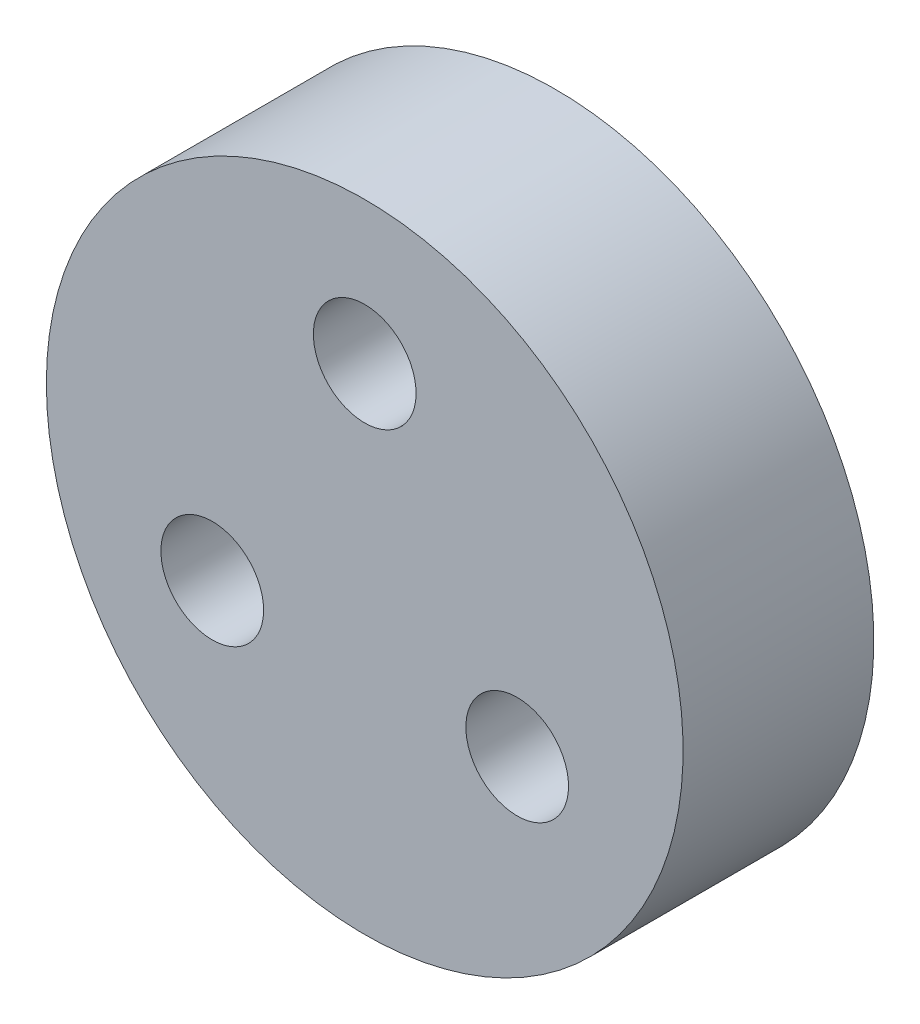
ISO-10303-21;
HEADER;
FILE_DESCRIPTION(('STEP AP214'),'2;1');
FILE_NAME('part.step','',(''),(''),'','','');
FILE_SCHEMA(('AUTOMOTIVE_DESIGN { 1 0 10303 214 1 1 1 1 }'));
ENDSEC;
DATA;
#1=APPLICATION_CONTEXT('core data for automotive mechanical design processes');
#2=APPLICATION_PROTOCOL_DEFINITION('international standard','automotive_design',2000,#1);
#3=PRODUCT_CONTEXT('',#1,'mechanical');
#4=PRODUCT('Part','Part','',(#3));
#5=PRODUCT_RELATED_PRODUCT_CATEGORY('part','',(#4));
#6=PRODUCT_DEFINITION_FORMATION('','',#4);
#7=PRODUCT_DEFINITION_CONTEXT('part definition',#1,'design');
#8=PRODUCT_DEFINITION('design','',#6,#7);
#9=PRODUCT_DEFINITION_SHAPE('','',#8);
#10=(LENGTH_UNIT() NAMED_UNIT(*) SI_UNIT(.MILLI.,.METRE.));
#11=(NAMED_UNIT(*) PLANE_ANGLE_UNIT() SI_UNIT($,.RADIAN.));
#12=(NAMED_UNIT(*) SI_UNIT($,.STERADIAN.) SOLID_ANGLE_UNIT());
#13=UNCERTAINTY_MEASURE_WITH_UNIT(LENGTH_MEASURE(1.E-05),#10,'distance_accuracy_value','');
#14=(GEOMETRIC_REPRESENTATION_CONTEXT(3) GLOBAL_UNCERTAINTY_ASSIGNED_CONTEXT((#13)) GLOBAL_UNIT_ASSIGNED_CONTEXT((#10,
#11,#12)) REPRESENTATION_CONTEXT('',''));
#15=CARTESIAN_POINT('',(0.,0.,0.));
#16=DIRECTION('',(0.,0.,1.));
#17=DIRECTION('',(1.,0.,0.));
#18=AXIS2_PLACEMENT_3D('',#15,#16,#17);
#19=CARTESIAN_POINT('',(0.,0.,6.5));
#20=DIRECTION('',(0.,0.,-1.));
#21=DIRECTION('',(-1.,0.,0.));
#22=AXIS2_PLACEMENT_3D('',#19,#20,#21);
#23=CYLINDRICAL_SURFACE('',#22,10.85);
#24=CARTESIAN_POINT('',(0.,0.,6.5));
#25=DIRECTION('',(0.,0.,1.));
#26=DIRECTION('',(1.,0.,0.));
#27=AXIS2_PLACEMENT_3D('',#24,#25,#26);
#28=CIRCLE('',#27,10.85);
#29=CARTESIAN_POINT('',(-10.85,0.,6.5));
#30=VERTEX_POINT('',#29);
#31=EDGE_CURVE('E10',#30,#30,#28,.T.);
#32=CARTESIAN_POINT('',(0.,0.,0.));
#33=DIRECTION('',(0.,0.,1.));
#34=DIRECTION('',(1.,0.,0.));
#35=AXIS2_PLACEMENT_3D('',#32,#33,#34);
#36=CIRCLE('',#35,10.85);
#37=CARTESIAN_POINT('',(-10.85,0.,0.));
#38=VERTEX_POINT('',#37);
#39=EDGE_CURVE('E36',#38,#38,#36,.T.);
#40=CARTESIAN_POINT('',(-10.85,0.,6.5));
#41=CARTESIAN_POINT('',(-10.85,0.,6.43229166666667));
#42=CARTESIAN_POINT('',(-10.85,0.,6.36458333333333));
#43=CARTESIAN_POINT('',(-10.85,0.,6.22916666666667));
#44=CARTESIAN_POINT('',(-10.85,0.,6.16145833333333));
#45=CARTESIAN_POINT('',(-10.85,0.,6.02604166666667));
#46=CARTESIAN_POINT('',(-10.85,0.,5.95833333333333));
#47=CARTESIAN_POINT('',(-10.85,0.,5.82291666666667));
#48=CARTESIAN_POINT('',(-10.85,0.,5.75520833333333));
#49=CARTESIAN_POINT('',(-10.85,0.,5.61979166666667));
#50=CARTESIAN_POINT('',(-10.85,0.,5.55208333333333));
#51=CARTESIAN_POINT('',(-10.85,0.,5.41666666666667));
#52=CARTESIAN_POINT('',(-10.85,0.,5.34895833333333));
#53=CARTESIAN_POINT('',(-10.85,0.,5.21354166666667));
#54=CARTESIAN_POINT('',(-10.85,0.,5.14583333333333));
#55=CARTESIAN_POINT('',(-10.85,0.,5.01041666666667));
#56=CARTESIAN_POINT('',(-10.85,0.,4.94270833333333));
#57=CARTESIAN_POINT('',(-10.85,0.,4.80729166666667));
#58=CARTESIAN_POINT('',(-10.85,0.,4.73958333333333));
#59=CARTESIAN_POINT('',(-10.85,0.,4.60416666666667));
#60=CARTESIAN_POINT('',(-10.85,0.,4.53645833333333));
#61=CARTESIAN_POINT('',(-10.85,0.,4.40104166666667));
#62=CARTESIAN_POINT('',(-10.85,0.,4.33333333333333));
#63=CARTESIAN_POINT('',(-10.85,0.,4.19791666666667));
#64=CARTESIAN_POINT('',(-10.85,0.,4.13020833333333));
#65=CARTESIAN_POINT('',(-10.85,0.,3.99479166666667));
#66=CARTESIAN_POINT('',(-10.85,0.,3.92708333333333));
#67=CARTESIAN_POINT('',(-10.85,0.,3.79166666666667));
#68=CARTESIAN_POINT('',(-10.85,0.,3.72395833333333));
#69=CARTESIAN_POINT('',(-10.85,0.,3.58854166666667));
#70=CARTESIAN_POINT('',(-10.85,0.,3.52083333333333));
#71=CARTESIAN_POINT('',(-10.85,0.,3.38541666666667));
#72=CARTESIAN_POINT('',(-10.85,0.,3.31770833333333));
#73=CARTESIAN_POINT('',(-10.85,0.,3.18229166666667));
#74=CARTESIAN_POINT('',(-10.85,0.,3.11458333333333));
#75=CARTESIAN_POINT('',(-10.85,0.,2.97916666666667));
#76=CARTESIAN_POINT('',(-10.85,0.,2.91145833333333));
#77=CARTESIAN_POINT('',(-10.85,0.,2.77604166666667));
#78=CARTESIAN_POINT('',(-10.85,0.,2.70833333333333));
#79=CARTESIAN_POINT('',(-10.85,0.,2.57291666666667));
#80=CARTESIAN_POINT('',(-10.85,0.,2.50520833333333));
#81=CARTESIAN_POINT('',(-10.85,0.,2.36979166666667));
#82=CARTESIAN_POINT('',(-10.85,0.,2.30208333333333));
#83=CARTESIAN_POINT('',(-10.85,0.,2.16666666666667));
#84=CARTESIAN_POINT('',(-10.85,0.,2.09895833333333));
#85=CARTESIAN_POINT('',(-10.85,0.,1.96354166666667));
#86=CARTESIAN_POINT('',(-10.85,0.,1.89583333333333));
#87=CARTESIAN_POINT('',(-10.85,0.,1.76041666666667));
#88=CARTESIAN_POINT('',(-10.85,0.,1.69270833333333));
#89=CARTESIAN_POINT('',(-10.85,0.,1.55729166666667));
#90=CARTESIAN_POINT('',(-10.85,0.,1.48958333333333));
#91=CARTESIAN_POINT('',(-10.85,0.,1.35416666666667));
#92=CARTESIAN_POINT('',(-10.85,0.,1.28645833333333));
#93=CARTESIAN_POINT('',(-10.85,0.,1.15104166666667));
#94=CARTESIAN_POINT('',(-10.85,0.,1.08333333333333));
#95=CARTESIAN_POINT('',(-10.85,0.,0.947916666666667));
#96=CARTESIAN_POINT('',(-10.85,0.,0.880208333333333));
#97=CARTESIAN_POINT('',(-10.85,0.,0.744791666666667));
#98=CARTESIAN_POINT('',(-10.85,0.,0.677083333333333));
#99=CARTESIAN_POINT('',(-10.85,0.,0.541666666666667));
#100=CARTESIAN_POINT('',(-10.85,0.,0.473958333333333));
#101=CARTESIAN_POINT('',(-10.85,0.,0.338541666666667));
#102=CARTESIAN_POINT('',(-10.85,0.,0.270833333333334));
#103=CARTESIAN_POINT('',(-10.85,0.,0.135416666666667));
#104=CARTESIAN_POINT('',(-10.85,0.,0.0677083333333334));
#105=CARTESIAN_POINT('',(-10.85,0.,0.));
#106=B_SPLINE_CURVE_WITH_KNOTS('',3,(#40,#41,#42,#43,#44,#45,#46,#47,#48,#49,#50,#51,#52,#53,
#54,#55,#56,#57,#58,#59,#60,#61,#62,#63,#64,#65,#66,#67,#68,#69,#70,#71,#72,#73,#74,#75,#76,#77,
#78,#79,#80,#81,#82,#83,#84,#85,#86,#87,#88,#89,#90,#91,#92,#93,#94,#95,#96,#97,#98,#99,#100,
#101,#102,#103,#104,#105),.UNSPECIFIED.,.F.,.F.,(4,2,2,2,2,2,2,2,2,2,2,2,2,2,2,2,2,2,2,2,2,2,2,
2,2,2,2,2,2,2,2,2,4),(0.,0.203124999999999,0.40625,0.609375,0.812499999999999,1.015625,1.21875,
1.421875,1.625,1.828125,2.03125,2.234375,2.4375,2.640625,2.84375,3.046875,3.25,3.453125,3.65625,
3.859375,4.0625,4.265625,4.46875,4.671875,4.875,5.078125,5.28125,5.484375,5.6875,5.890625,
6.09375,6.296875,6.5),.UNSPECIFIED.);
#107=EDGE_CURVE('BSEAM33',#30,#38,#106,.T.);
#108=ORIENTED_EDGE('',*,*,#31,.F.);
#109=ORIENTED_EDGE('',*,*,#39,.T.);
#110=ORIENTED_EDGE('',*,*,#107,.T.);
#111=ORIENTED_EDGE('',*,*,#107,.F.);
#112=EDGE_LOOP('',(#108,#110,#109,#111));
#113=FACE_BOUND('',#112,.T.);
#114=ADVANCED_FACE('F33',(#113),#23,.T.);
#115=CARTESIAN_POINT('',(0.,0.,6.5));
#116=DIRECTION('',(0.,0.,1.));
#117=DIRECTION('',(1.,0.,0.));
#118=AXIS2_PLACEMENT_3D('',#115,#116,#117);
#119=PLANE('',#118);
#120=CARTESIAN_POINT('',(0.,6.,6.5));
#121=DIRECTION('',(0.,0.,1.));
#122=DIRECTION('',(1.,0.,0.));
#123=AXIS2_PLACEMENT_3D('',#120,#121,#122);
#124=CIRCLE('',#123,1.75);
#125=CARTESIAN_POINT('',(1.75,6.,6.5));
#126=VERTEX_POINT('',#125);
#127=EDGE_CURVE('E57',#126,#126,#124,.T.);
#128=ORIENTED_EDGE('',*,*,#127,.F.);
#129=EDGE_LOOP('',(#128));
#130=FACE_BOUND('',#129,.T.);
#131=CARTESIAN_POINT('',(5.19615242270689,-2.99999999999985,6.5));
#132=DIRECTION('',(0.,0.,1.));
#133=DIRECTION('',(1.,0.,0.));
#134=AXIS2_PLACEMENT_3D('',#131,#132,#133);
#135=CIRCLE('',#134,1.75000000000023);
#136=CARTESIAN_POINT('',(6.94615242270711,-2.99999999999985,6.5));
#137=VERTEX_POINT('',#136);
#138=EDGE_CURVE('E51',#137,#137,#135,.T.);
#139=ORIENTED_EDGE('',*,*,#138,.F.);
#140=EDGE_LOOP('',(#139));
#141=FACE_BOUND('',#140,.T.);
#142=CARTESIAN_POINT('',(-5.19615242270638,-3.00000000000015,6.5));
#143=DIRECTION('',(0.,0.,1.));
#144=DIRECTION('',(1.,0.,0.));
#145=AXIS2_PLACEMENT_3D('',#142,#143,#144);
#146=CIRCLE('',#145,1.75000000000034);
#147=CARTESIAN_POINT('',(-3.44615242270604,-3.00000000000015,6.5));
#148=VERTEX_POINT('',#147);
#149=EDGE_CURVE('E45',#148,#148,#146,.T.);
#150=ORIENTED_EDGE('',*,*,#149,.F.);
#151=EDGE_LOOP('',(#150));
#152=FACE_BOUND('',#151,.T.);
#153=ORIENTED_EDGE('',*,*,#31,.T.);
#154=EDGE_LOOP('',(#153));
#155=FACE_BOUND('',#154,.T.);
#156=ADVANCED_FACE('F73',(#130,#141,#152,#155),#119,.T.);
#157=CARTESIAN_POINT('',(0.,0.,0.));
#158=DIRECTION('',(0.,0.,1.));
#159=DIRECTION('',(1.,0.,0.));
#160=AXIS2_PLACEMENT_3D('',#157,#158,#159);
#161=PLANE('',#160);
#162=CARTESIAN_POINT('',(0.,6.,0.));
#163=DIRECTION('',(0.,0.,1.));
#164=DIRECTION('',(1.,0.,0.));
#165=AXIS2_PLACEMENT_3D('',#162,#163,#164);
#166=CIRCLE('',#165,1.75);
#167=CARTESIAN_POINT('',(1.75,6.,0.));
#168=VERTEX_POINT('',#167);
#169=EDGE_CURVE('E43',#168,#168,#166,.T.);
#170=ORIENTED_EDGE('',*,*,#169,.T.);
#171=EDGE_LOOP('',(#170));
#172=FACE_BOUND('',#171,.T.);
#173=CARTESIAN_POINT('',(5.19615242270689,-2.99999999999985,0.));
#174=DIRECTION('',(0.,0.,1.));
#175=DIRECTION('',(1.,0.,0.));
#176=AXIS2_PLACEMENT_3D('',#173,#174,#175);
#177=CIRCLE('',#176,1.75000000000023);
#178=CARTESIAN_POINT('',(6.94615242270711,-2.99999999999985,0.));
#179=VERTEX_POINT('',#178);
#180=EDGE_CURVE('E54',#179,#179,#177,.T.);
#181=ORIENTED_EDGE('',*,*,#180,.T.);
#182=EDGE_LOOP('',(#181));
#183=FACE_BOUND('',#182,.T.);
#184=CARTESIAN_POINT('',(-5.19615242270638,-3.00000000000015,0.));
#185=DIRECTION('',(0.,0.,1.));
#186=DIRECTION('',(1.,0.,0.));
#187=AXIS2_PLACEMENT_3D('',#184,#185,#186);
#188=CIRCLE('',#187,1.75000000000034);
#189=CARTESIAN_POINT('',(-3.44615242270604,-3.00000000000015,0.));
#190=VERTEX_POINT('',#189);
#191=EDGE_CURVE('E48',#190,#190,#188,.T.);
#192=ORIENTED_EDGE('',*,*,#191,.T.);
#193=EDGE_LOOP('',(#192));
#194=FACE_BOUND('',#193,.T.);
#195=ORIENTED_EDGE('',*,*,#39,.F.);
#196=EDGE_LOOP('',(#195));
#197=FACE_BOUND('',#196,.T.);
#198=ADVANCED_FACE('F63',(#172,#183,#194,#197),#161,.F.);
#199=CARTESIAN_POINT('',(-5.19615242270638,-3.00000000000015,0.));
#200=DIRECTION('',(0.,0.,1.));
#201=DIRECTION('',(1.,0.,0.));
#202=AXIS2_PLACEMENT_3D('',#199,#200,#201);
#203=CYLINDRICAL_SURFACE('',#202,1.75000000000034);
#204=CARTESIAN_POINT('',(-3.44615242270604,-3.00000000000015,0.));
#205=CARTESIAN_POINT('',(-3.44615242270604,-3.00000000000015,0.0677083333333332));
#206=CARTESIAN_POINT('',(-3.44615242270604,-3.00000000000015,0.135416666666667));
#207=CARTESIAN_POINT('',(-3.44615242270604,-3.00000000000015,0.270833333333333));
#208=CARTESIAN_POINT('',(-3.44615242270604,-3.00000000000015,0.338541666666667));
#209=CARTESIAN_POINT('',(-3.44615242270604,-3.00000000000015,0.473958333333333));
#210=CARTESIAN_POINT('',(-3.44615242270604,-3.00000000000015,0.541666666666667));
#211=CARTESIAN_POINT('',(-3.44615242270604,-3.00000000000015,0.677083333333333));
#212=CARTESIAN_POINT('',(-3.44615242270604,-3.00000000000015,0.744791666666667));
#213=CARTESIAN_POINT('',(-3.44615242270604,-3.00000000000015,0.880208333333333));
#214=CARTESIAN_POINT('',(-3.44615242270604,-3.00000000000015,0.947916666666667));
#215=CARTESIAN_POINT('',(-3.44615242270604,-3.00000000000015,1.08333333333333));
#216=CARTESIAN_POINT('',(-3.44615242270604,-3.00000000000015,1.15104166666667));
#217=CARTESIAN_POINT('',(-3.44615242270604,-3.00000000000015,1.28645833333333));
#218=CARTESIAN_POINT('',(-3.44615242270604,-3.00000000000015,1.35416666666667));
#219=CARTESIAN_POINT('',(-3.44615242270604,-3.00000000000015,1.48958333333333));
#220=CARTESIAN_POINT('',(-3.44615242270604,-3.00000000000015,1.55729166666667));
#221=CARTESIAN_POINT('',(-3.44615242270604,-3.00000000000015,1.69270833333333));
#222=CARTESIAN_POINT('',(-3.44615242270604,-3.00000000000015,1.76041666666667));
#223=CARTESIAN_POINT('',(-3.44615242270604,-3.00000000000015,1.89583333333333));
#224=CARTESIAN_POINT('',(-3.44615242270604,-3.00000000000015,1.96354166666667));
#225=CARTESIAN_POINT('',(-3.44615242270604,-3.00000000000015,2.09895833333333));
#226=CARTESIAN_POINT('',(-3.44615242270604,-3.00000000000015,2.16666666666667));
#227=CARTESIAN_POINT('',(-3.44615242270604,-3.00000000000015,2.30208333333333));
#228=CARTESIAN_POINT('',(-3.44615242270604,-3.00000000000015,2.36979166666667));
#229=CARTESIAN_POINT('',(-3.44615242270604,-3.00000000000015,2.50520833333333));
#230=CARTESIAN_POINT('',(-3.44615242270604,-3.00000000000015,2.57291666666667));
#231=CARTESIAN_POINT('',(-3.44615242270604,-3.00000000000015,2.70833333333333));
#232=CARTESIAN_POINT('',(-3.44615242270604,-3.00000000000015,2.77604166666667));
#233=CARTESIAN_POINT('',(-3.44615242270604,-3.00000000000015,2.91145833333333));
#234=CARTESIAN_POINT('',(-3.44615242270604,-3.00000000000015,2.97916666666667));
#235=CARTESIAN_POINT('',(-3.44615242270604,-3.00000000000015,3.11458333333333));
#236=CARTESIAN_POINT('',(-3.44615242270604,-3.00000000000015,3.18229166666667));
#237=CARTESIAN_POINT('',(-3.44615242270604,-3.00000000000015,3.31770833333333));
#238=CARTESIAN_POINT('',(-3.44615242270604,-3.00000000000015,3.38541666666667));
#239=CARTESIAN_POINT('',(-3.44615242270604,-3.00000000000015,3.52083333333333));
#240=CARTESIAN_POINT('',(-3.44615242270604,-3.00000000000015,3.58854166666667));
#241=CARTESIAN_POINT('',(-3.44615242270604,-3.00000000000015,3.72395833333333));
#242=CARTESIAN_POINT('',(-3.44615242270604,-3.00000000000015,3.79166666666667));
#243=CARTESIAN_POINT('',(-3.44615242270604,-3.00000000000015,3.92708333333333));
#244=CARTESIAN_POINT('',(-3.44615242270604,-3.00000000000015,3.99479166666667));
#245=CARTESIAN_POINT('',(-3.44615242270604,-3.00000000000015,4.13020833333333));
#246=CARTESIAN_POINT('',(-3.44615242270604,-3.00000000000015,4.19791666666667));
#247=CARTESIAN_POINT('',(-3.44615242270604,-3.00000000000015,4.33333333333333));
#248=CARTESIAN_POINT('',(-3.44615242270604,-3.00000000000015,4.40104166666667));
#249=CARTESIAN_POINT('',(-3.44615242270604,-3.00000000000015,4.53645833333333));
#250=CARTESIAN_POINT('',(-3.44615242270604,-3.00000000000015,4.60416666666667));
#251=CARTESIAN_POINT('',(-3.44615242270604,-3.00000000000015,4.73958333333333));
#252=CARTESIAN_POINT('',(-3.44615242270604,-3.00000000000015,4.80729166666667));
#253=CARTESIAN_POINT('',(-3.44615242270604,-3.00000000000015,4.94270833333333));
#254=CARTESIAN_POINT('',(-3.44615242270604,-3.00000000000015,5.01041666666667));
#255=CARTESIAN_POINT('',(-3.44615242270604,-3.00000000000015,5.14583333333333));
#256=CARTESIAN_POINT('',(-3.44615242270604,-3.00000000000015,5.21354166666667));
#257=CARTESIAN_POINT('',(-3.44615242270604,-3.00000000000015,5.34895833333333));
#258=CARTESIAN_POINT('',(-3.44615242270604,-3.00000000000015,5.41666666666667));
#259=CARTESIAN_POINT('',(-3.44615242270604,-3.00000000000015,5.55208333333333));
#260=CARTESIAN_POINT('',(-3.44615242270604,-3.00000000000015,5.61979166666667));
#261=CARTESIAN_POINT('',(-3.44615242270604,-3.00000000000015,5.75520833333333));
#262=CARTESIAN_POINT('',(-3.44615242270604,-3.00000000000015,5.82291666666667));
#263=CARTESIAN_POINT('',(-3.44615242270604,-3.00000000000015,5.95833333333333));
#264=CARTESIAN_POINT('',(-3.44615242270604,-3.00000000000015,6.02604166666667));
#265=CARTESIAN_POINT('',(-3.44615242270604,-3.00000000000015,6.16145833333333));
#266=CARTESIAN_POINT('',(-3.44615242270604,-3.00000000000015,6.22916666666667));
#267=CARTESIAN_POINT('',(-3.44615242270604,-3.00000000000015,6.36458333333333));
#268=CARTESIAN_POINT('',(-3.44615242270604,-3.00000000000015,6.43229166666667));
#269=CARTESIAN_POINT('',(-3.44615242270604,-3.00000000000015,6.5));
#270=B_SPLINE_CURVE_WITH_KNOTS('',3,(#204,#205,#206,#207,#208,#209,#210,#211,#212,#213,#214,
#215,#216,#217,#218,#219,#220,#221,#222,#223,#224,#225,#226,#227,#228,#229,#230,#231,#232,#233,
#234,#235,#236,#237,#238,#239,#240,#241,#242,#243,#244,#245,#246,#247,#248,#249,#250,#251,#252,
#253,#254,#255,#256,#257,#258,#259,#260,#261,#262,#263,#264,#265,#266,#267,#268,#269),
.UNSPECIFIED.,.F.,.F.,(4,2,2,2,2,2,2,2,2,2,2,2,2,2,2,2,2,2,2,2,2,2,2,2,2,2,2,2,2,2,2,2,4),(0.,
0.203125,0.40625,0.609375,0.8125,1.015625,1.21875,1.421875,1.625,1.828125,2.03125,2.234375,
2.4375,2.640625,2.84375,3.046875,3.25,3.453125,3.65625,3.859375,4.0625,4.265625,4.46875,
4.671875,4.875,5.078125,5.28125,5.484375,5.6875,5.890625,6.09375,6.296875,6.5),.UNSPECIFIED.);
#271=EDGE_CURVE('BSEAM81',#190,#148,#270,.T.);
#272=ORIENTED_EDGE('',*,*,#191,.F.);
#273=ORIENTED_EDGE('',*,*,#149,.T.);
#274=ORIENTED_EDGE('',*,*,#271,.T.);
#275=ORIENTED_EDGE('',*,*,#271,.F.);
#276=EDGE_LOOP('',(#272,#274,#273,#275));
#277=FACE_BOUND('',#276,.T.);
#278=ADVANCED_FACE('F81',(#277),#203,.F.);
#279=CARTESIAN_POINT('',(5.19615242270689,-2.99999999999985,0.));
#280=DIRECTION('',(0.,0.,1.));
#281=DIRECTION('',(1.,0.,0.));
#282=AXIS2_PLACEMENT_3D('',#279,#280,#281);
#283=CYLINDRICAL_SURFACE('',#282,1.75000000000023);
#284=CARTESIAN_POINT('',(6.94615242270711,-2.99999999999985,0.));
#285=CARTESIAN_POINT('',(6.94615242270711,-2.99999999999985,0.0677083333333332));
#286=CARTESIAN_POINT('',(6.94615242270711,-2.99999999999985,0.135416666666667));
#287=CARTESIAN_POINT('',(6.94615242270711,-2.99999999999985,0.270833333333333));
#288=CARTESIAN_POINT('',(6.94615242270711,-2.99999999999985,0.338541666666667));
#289=CARTESIAN_POINT('',(6.94615242270711,-2.99999999999985,0.473958333333333));
#290=CARTESIAN_POINT('',(6.94615242270711,-2.99999999999985,0.541666666666667));
#291=CARTESIAN_POINT('',(6.94615242270711,-2.99999999999985,0.677083333333333));
#292=CARTESIAN_POINT('',(6.94615242270711,-2.99999999999985,0.744791666666667));
#293=CARTESIAN_POINT('',(6.94615242270711,-2.99999999999985,0.880208333333333));
#294=CARTESIAN_POINT('',(6.94615242270711,-2.99999999999985,0.947916666666667));
#295=CARTESIAN_POINT('',(6.94615242270711,-2.99999999999985,1.08333333333333));
#296=CARTESIAN_POINT('',(6.94615242270711,-2.99999999999985,1.15104166666667));
#297=CARTESIAN_POINT('',(6.94615242270711,-2.99999999999985,1.28645833333333));
#298=CARTESIAN_POINT('',(6.94615242270711,-2.99999999999985,1.35416666666667));
#299=CARTESIAN_POINT('',(6.94615242270711,-2.99999999999985,1.48958333333333));
#300=CARTESIAN_POINT('',(6.94615242270711,-2.99999999999985,1.55729166666667));
#301=CARTESIAN_POINT('',(6.94615242270711,-2.99999999999985,1.69270833333333));
#302=CARTESIAN_POINT('',(6.94615242270711,-2.99999999999985,1.76041666666667));
#303=CARTESIAN_POINT('',(6.94615242270711,-2.99999999999985,1.89583333333333));
#304=CARTESIAN_POINT('',(6.94615242270711,-2.99999999999985,1.96354166666667));
#305=CARTESIAN_POINT('',(6.94615242270711,-2.99999999999985,2.09895833333333));
#306=CARTESIAN_POINT('',(6.94615242270711,-2.99999999999985,2.16666666666667));
#307=CARTESIAN_POINT('',(6.94615242270711,-2.99999999999985,2.30208333333333));
#308=CARTESIAN_POINT('',(6.94615242270711,-2.99999999999985,2.36979166666667));
#309=CARTESIAN_POINT('',(6.94615242270711,-2.99999999999985,2.50520833333333));
#310=CARTESIAN_POINT('',(6.94615242270711,-2.99999999999985,2.57291666666667));
#311=CARTESIAN_POINT('',(6.94615242270711,-2.99999999999985,2.70833333333333));
#312=CARTESIAN_POINT('',(6.94615242270711,-2.99999999999985,2.77604166666667));
#313=CARTESIAN_POINT('',(6.94615242270711,-2.99999999999985,2.91145833333333));
#314=CARTESIAN_POINT('',(6.94615242270711,-2.99999999999985,2.97916666666667));
#315=CARTESIAN_POINT('',(6.94615242270711,-2.99999999999985,3.11458333333333));
#316=CARTESIAN_POINT('',(6.94615242270711,-2.99999999999985,3.18229166666667));
#317=CARTESIAN_POINT('',(6.94615242270711,-2.99999999999985,3.31770833333333));
#318=CARTESIAN_POINT('',(6.94615242270711,-2.99999999999985,3.38541666666667));
#319=CARTESIAN_POINT('',(6.94615242270711,-2.99999999999985,3.52083333333333));
#320=CARTESIAN_POINT('',(6.94615242270711,-2.99999999999985,3.58854166666667));
#321=CARTESIAN_POINT('',(6.94615242270711,-2.99999999999985,3.72395833333333));
#322=CARTESIAN_POINT('',(6.94615242270711,-2.99999999999985,3.79166666666667));
#323=CARTESIAN_POINT('',(6.94615242270711,-2.99999999999985,3.92708333333333));
#324=CARTESIAN_POINT('',(6.94615242270711,-2.99999999999985,3.99479166666667));
#325=CARTESIAN_POINT('',(6.94615242270711,-2.99999999999985,4.13020833333333));
#326=CARTESIAN_POINT('',(6.94615242270711,-2.99999999999985,4.19791666666667));
#327=CARTESIAN_POINT('',(6.94615242270711,-2.99999999999985,4.33333333333333));
#328=CARTESIAN_POINT('',(6.94615242270711,-2.99999999999985,4.40104166666667));
#329=CARTESIAN_POINT('',(6.94615242270711,-2.99999999999985,4.53645833333333));
#330=CARTESIAN_POINT('',(6.94615242270711,-2.99999999999985,4.60416666666667));
#331=CARTESIAN_POINT('',(6.94615242270711,-2.99999999999985,4.73958333333333));
#332=CARTESIAN_POINT('',(6.94615242270711,-2.99999999999985,4.80729166666667));
#333=CARTESIAN_POINT('',(6.94615242270711,-2.99999999999985,4.94270833333333));
#334=CARTESIAN_POINT('',(6.94615242270711,-2.99999999999985,5.01041666666667));
#335=CARTESIAN_POINT('',(6.94615242270711,-2.99999999999985,5.14583333333333));
#336=CARTESIAN_POINT('',(6.94615242270711,-2.99999999999985,5.21354166666667));
#337=CARTESIAN_POINT('',(6.94615242270711,-2.99999999999985,5.34895833333333));
#338=CARTESIAN_POINT('',(6.94615242270711,-2.99999999999985,5.41666666666667));
#339=CARTESIAN_POINT('',(6.94615242270711,-2.99999999999985,5.55208333333333));
#340=CARTESIAN_POINT('',(6.94615242270711,-2.99999999999985,5.61979166666667));
#341=CARTESIAN_POINT('',(6.94615242270711,-2.99999999999985,5.75520833333333));
#342=CARTESIAN_POINT('',(6.94615242270711,-2.99999999999985,5.82291666666667));
#343=CARTESIAN_POINT('',(6.94615242270711,-2.99999999999985,5.95833333333333));
#344=CARTESIAN_POINT('',(6.94615242270711,-2.99999999999985,6.02604166666667));
#345=CARTESIAN_POINT('',(6.94615242270711,-2.99999999999985,6.16145833333333));
#346=CARTESIAN_POINT('',(6.94615242270711,-2.99999999999985,6.22916666666667));
#347=CARTESIAN_POINT('',(6.94615242270711,-2.99999999999985,6.36458333333333));
#348=CARTESIAN_POINT('',(6.94615242270711,-2.99999999999985,6.43229166666667));
#349=CARTESIAN_POINT('',(6.94615242270711,-2.99999999999985,6.5));
#350=B_SPLINE_CURVE_WITH_KNOTS('',3,(#284,#285,#286,#287,#288,#289,#290,#291,#292,#293,#294,
#295,#296,#297,#298,#299,#300,#301,#302,#303,#304,#305,#306,#307,#308,#309,#310,#311,#312,#313,
#314,#315,#316,#317,#318,#319,#320,#321,#322,#323,#324,#325,#326,#327,#328,#329,#330,#331,#332,
#333,#334,#335,#336,#337,#338,#339,#340,#341,#342,#343,#344,#345,#346,#347,#348,#349),
.UNSPECIFIED.,.F.,.F.,(4,2,2,2,2,2,2,2,2,2,2,2,2,2,2,2,2,2,2,2,2,2,2,2,2,2,2,2,2,2,2,2,4),(0.,
0.203125,0.40625,0.609375,0.8125,1.015625,1.21875,1.421875,1.625,1.828125,2.03125,2.234375,
2.4375,2.640625,2.84375,3.046875,3.25,3.453125,3.65625,3.859375,4.0625,4.265625,4.46875,
4.671875,4.875,5.078125,5.28125,5.484375,5.6875,5.890625,6.09375,6.296875,6.5),.UNSPECIFIED.);
#351=EDGE_CURVE('BSEAM69',#179,#137,#350,.T.);
#352=ORIENTED_EDGE('',*,*,#180,.F.);
#353=ORIENTED_EDGE('',*,*,#138,.T.);
#354=ORIENTED_EDGE('',*,*,#351,.T.);
#355=ORIENTED_EDGE('',*,*,#351,.F.);
#356=EDGE_LOOP('',(#352,#354,#353,#355));
#357=FACE_BOUND('',#356,.T.);
#358=ADVANCED_FACE('F69',(#357),#283,.F.);
#359=CARTESIAN_POINT('',(0.,6.,0.));
#360=DIRECTION('',(0.,0.,1.));
#361=DIRECTION('',(1.,0.,0.));
#362=AXIS2_PLACEMENT_3D('',#359,#360,#361);
#363=CYLINDRICAL_SURFACE('',#362,1.75);
#364=CARTESIAN_POINT('',(1.75,6.,0.));
#365=CARTESIAN_POINT('',(1.75,6.,0.0677083333333332));
#366=CARTESIAN_POINT('',(1.75,6.,0.135416666666667));
#367=CARTESIAN_POINT('',(1.75,6.,0.270833333333333));
#368=CARTESIAN_POINT('',(1.75,6.,0.338541666666667));
#369=CARTESIAN_POINT('',(1.75,6.,0.473958333333333));
#370=CARTESIAN_POINT('',(1.75,6.,0.541666666666667));
#371=CARTESIAN_POINT('',(1.75,6.,0.677083333333333));
#372=CARTESIAN_POINT('',(1.75,6.,0.744791666666667));
#373=CARTESIAN_POINT('',(1.75,6.,0.880208333333333));
#374=CARTESIAN_POINT('',(1.75,6.,0.947916666666667));
#375=CARTESIAN_POINT('',(1.75,6.,1.08333333333333));
#376=CARTESIAN_POINT('',(1.75,6.,1.15104166666667));
#377=CARTESIAN_POINT('',(1.75,6.,1.28645833333333));
#378=CARTESIAN_POINT('',(1.75,6.,1.35416666666667));
#379=CARTESIAN_POINT('',(1.75,6.,1.48958333333333));
#380=CARTESIAN_POINT('',(1.75,6.,1.55729166666667));
#381=CARTESIAN_POINT('',(1.75,6.,1.69270833333333));
#382=CARTESIAN_POINT('',(1.75,6.,1.76041666666667));
#383=CARTESIAN_POINT('',(1.75,6.,1.89583333333333));
#384=CARTESIAN_POINT('',(1.75,6.,1.96354166666667));
#385=CARTESIAN_POINT('',(1.75,6.,2.09895833333333));
#386=CARTESIAN_POINT('',(1.75,6.,2.16666666666667));
#387=CARTESIAN_POINT('',(1.75,6.,2.30208333333333));
#388=CARTESIAN_POINT('',(1.75,6.,2.36979166666667));
#389=CARTESIAN_POINT('',(1.75,6.,2.50520833333333));
#390=CARTESIAN_POINT('',(1.75,6.,2.57291666666667));
#391=CARTESIAN_POINT('',(1.75,6.,2.70833333333333));
#392=CARTESIAN_POINT('',(1.75,6.,2.77604166666667));
#393=CARTESIAN_POINT('',(1.75,6.,2.91145833333333));
#394=CARTESIAN_POINT('',(1.75,6.,2.97916666666667));
#395=CARTESIAN_POINT('',(1.75,6.,3.11458333333333));
#396=CARTESIAN_POINT('',(1.75,6.,3.18229166666667));
#397=CARTESIAN_POINT('',(1.75,6.,3.31770833333333));
#398=CARTESIAN_POINT('',(1.75,6.,3.38541666666667));
#399=CARTESIAN_POINT('',(1.75,6.,3.52083333333333));
#400=CARTESIAN_POINT('',(1.75,6.,3.58854166666667));
#401=CARTESIAN_POINT('',(1.75,6.,3.72395833333333));
#402=CARTESIAN_POINT('',(1.75,6.,3.79166666666667));
#403=CARTESIAN_POINT('',(1.75,6.,3.92708333333333));
#404=CARTESIAN_POINT('',(1.75,6.,3.99479166666667));
#405=CARTESIAN_POINT('',(1.75,6.,4.13020833333333));
#406=CARTESIAN_POINT('',(1.75,6.,4.19791666666667));
#407=CARTESIAN_POINT('',(1.75,6.,4.33333333333333));
#408=CARTESIAN_POINT('',(1.75,6.,4.40104166666667));
#409=CARTESIAN_POINT('',(1.75,6.,4.53645833333333));
#410=CARTESIAN_POINT('',(1.75,6.,4.60416666666667));
#411=CARTESIAN_POINT('',(1.75,6.,4.73958333333333));
#412=CARTESIAN_POINT('',(1.75,6.,4.80729166666667));
#413=CARTESIAN_POINT('',(1.75,6.,4.94270833333333));
#414=CARTESIAN_POINT('',(1.75,6.,5.01041666666667));
#415=CARTESIAN_POINT('',(1.75,6.,5.14583333333333));
#416=CARTESIAN_POINT('',(1.75,6.,5.21354166666667));
#417=CARTESIAN_POINT('',(1.75,6.,5.34895833333333));
#418=CARTESIAN_POINT('',(1.75,6.,5.41666666666667));
#419=CARTESIAN_POINT('',(1.75,6.,5.55208333333333));
#420=CARTESIAN_POINT('',(1.75,6.,5.61979166666667));
#421=CARTESIAN_POINT('',(1.75,6.,5.75520833333333));
#422=CARTESIAN_POINT('',(1.75,6.,5.82291666666667));
#423=CARTESIAN_POINT('',(1.75,6.,5.95833333333333));
#424=CARTESIAN_POINT('',(1.75,6.,6.02604166666667));
#425=CARTESIAN_POINT('',(1.75,6.,6.16145833333333));
#426=CARTESIAN_POINT('',(1.75,6.,6.22916666666667));
#427=CARTESIAN_POINT('',(1.75,6.,6.36458333333333));
#428=CARTESIAN_POINT('',(1.75,6.,6.43229166666667));
#429=CARTESIAN_POINT('',(1.75,6.,6.5));
#430=B_SPLINE_CURVE_WITH_KNOTS('',3,(#364,#365,#366,#367,#368,#369,#370,#371,#372,#373,#374,
#375,#376,#377,#378,#379,#380,#381,#382,#383,#384,#385,#386,#387,#388,#389,#390,#391,#392,#393,
#394,#395,#396,#397,#398,#399,#400,#401,#402,#403,#404,#405,#406,#407,#408,#409,#410,#411,#412,
#413,#414,#415,#416,#417,#418,#419,#420,#421,#422,#423,#424,#425,#426,#427,#428,#429),
.UNSPECIFIED.,.F.,.F.,(4,2,2,2,2,2,2,2,2,2,2,2,2,2,2,2,2,2,2,2,2,2,2,2,2,2,2,2,2,2,2,2,4),(0.,
0.203125,0.40625,0.609375,0.8125,1.015625,1.21875,1.421875,1.625,1.828125,2.03125,2.234375,
2.4375,2.640625,2.84375,3.046875,3.25,3.453125,3.65625,3.859375,4.0625,4.265625,4.46875,
4.671875,4.875,5.078125,5.28125,5.484375,5.6875,5.890625,6.09375,6.296875,6.5),.UNSPECIFIED.);
#431=EDGE_CURVE('BSEAM66',#168,#126,#430,.T.);
#432=ORIENTED_EDGE('',*,*,#169,.F.);
#433=ORIENTED_EDGE('',*,*,#127,.T.);
#434=ORIENTED_EDGE('',*,*,#431,.T.);
#435=ORIENTED_EDGE('',*,*,#431,.F.);
#436=EDGE_LOOP('',(#432,#434,#433,#435));
#437=FACE_BOUND('',#436,.T.);
#438=ADVANCED_FACE('F66',(#437),#363,.F.);
#439=CLOSED_SHELL('',(#114,#156,#198,#278,#358,#438));
#440=MANIFOLD_SOLID_BREP('B2',#439);
#441=ADVANCED_BREP_SHAPE_REPRESENTATION('',(#18,#440),#14);
#442=SHAPE_DEFINITION_REPRESENTATION(#9,#441);
ENDSEC;
END-ISO-10303-21;
